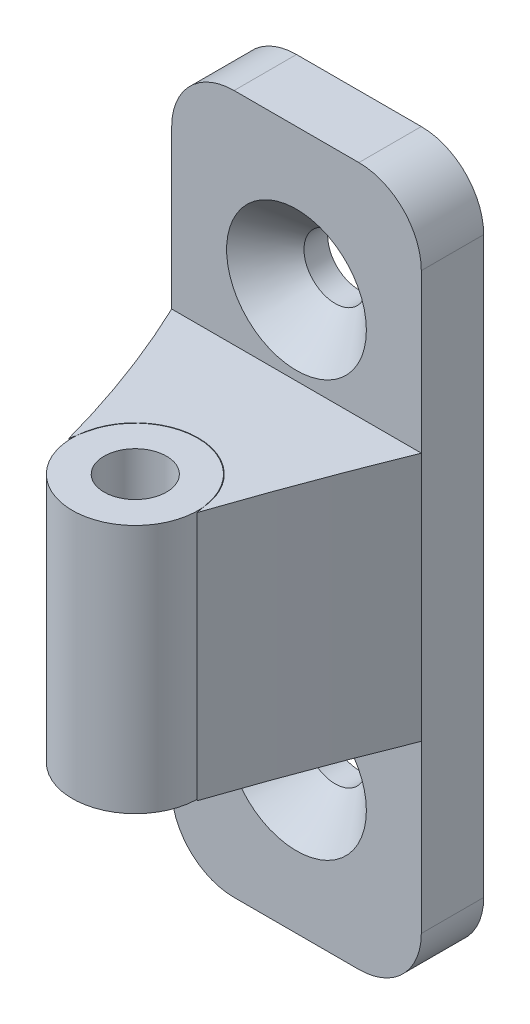
ISO-10303-21;
HEADER;
FILE_DESCRIPTION(('STEP AP214'),'2;1');
FILE_NAME('part.step','',(''),(''),'','','');
FILE_SCHEMA(('AUTOMOTIVE_DESIGN { 1 0 10303 214 1 1 1 1 }'));
ENDSEC;
DATA;
#1=APPLICATION_CONTEXT('core data for automotive mechanical design processes');
#2=APPLICATION_PROTOCOL_DEFINITION('international standard','automotive_design',2000,#1);
#3=PRODUCT_CONTEXT('',#1,'mechanical');
#4=PRODUCT('Part','Part','',(#3));
#5=PRODUCT_RELATED_PRODUCT_CATEGORY('part','',(#4));
#6=PRODUCT_DEFINITION_FORMATION('','',#4);
#7=PRODUCT_DEFINITION_CONTEXT('part definition',#1,'design');
#8=PRODUCT_DEFINITION('design','',#6,#7);
#9=PRODUCT_DEFINITION_SHAPE('','',#8);
#10=(LENGTH_UNIT() NAMED_UNIT(*) SI_UNIT(.MILLI.,.METRE.));
#11=(NAMED_UNIT(*) PLANE_ANGLE_UNIT() SI_UNIT($,.RADIAN.));
#12=(NAMED_UNIT(*) SI_UNIT($,.STERADIAN.) SOLID_ANGLE_UNIT());
#13=UNCERTAINTY_MEASURE_WITH_UNIT(LENGTH_MEASURE(1.E-05),#10,'distance_accuracy_value','');
#14=(GEOMETRIC_REPRESENTATION_CONTEXT(3) GLOBAL_UNCERTAINTY_ASSIGNED_CONTEXT((#13)) GLOBAL_UNIT_ASSIGNED_CONTEXT((#10,
#11,#12)) REPRESENTATION_CONTEXT('',''));
#15=CARTESIAN_POINT('',(0.,0.,0.));
#16=DIRECTION('',(0.,0.,1.));
#17=DIRECTION('',(1.,0.,0.));
#18=AXIS2_PLACEMENT_3D('',#15,#16,#17);
#19=CARTESIAN_POINT('',(45.4748031611298,-162.999999780208,24.4748018908058));
#20=DIRECTION('',(0.,-1.,0.));
#21=DIRECTION('',(0.,0.,-1.));
#22=AXIS2_PLACEMENT_3D('',#19,#20,#21);
#23=PLANE('',#22);
#24=DIRECTION('',(0.201858770187163,0.,0.979414639924545));
#25=VECTOR('',#24,1.);
#26=CARTESIAN_POINT('',(48.413047267168,-162.999999780208,23.1192250065496));
#27=LINE('',#26,#25);
#28=CARTESIAN_POINT('',(48.491701190835,-162.999999780208,23.5008522415495));
#29=VERTEX_POINT('',#28);
#30=CARTESIAN_POINT('',(48.5610012463893,-162.999999780208,23.8370946990582));
#31=VERTEX_POINT('',#30);
#32=EDGE_CURVE('P0_E11',#29,#31,#27,.T.);
#33=ORIENTED_EDGE('',*,*,#32,.T.);
#34=CARTESIAN_POINT('',(188.269411923261,-162.999999780208,71.1425910619827));
#35=DIRECTION('',(0.,1.,0.));
#36=DIRECTION('',(-0.947175665605907,0.,-0.320715229579149));
#37=AXIS2_PLACEMENT_3D('',#34,#35,#36);
#38=CIRCLE('',#37,147.5);
#39=CARTESIAN_POINT('',(51.4748032505368,-162.999999780208,15.9748012016271));
#40=VERTEX_POINT('',#39);
#41=EDGE_CURVE('P0_E212',#40,#31,#38,.T.);
#42=ORIENTED_EDGE('',*,*,#41,.F.);
#43=DIRECTION('',(1.,0.,0.));
#44=VECTOR('',#43,1.);
#45=CARTESIAN_POINT('',(47.9748031983828,-162.999999780208,15.9748012016271));
#46=LINE('',#45,#44);
#47=CARTESIAN_POINT('',(39.4748030717229,-162.999999780208,15.9748012016271));
#48=VERTEX_POINT('',#47);
#49=EDGE_CURVE('P0_E197',#48,#40,#46,.T.);
#50=ORIENTED_EDGE('',*,*,#49,.F.);
#51=CARTESIAN_POINT('',(-3.19879607523376,-162.999999780208,36.2609155620673));
#52=DIRECTION('',(0.,-1.,0.));
#53=DIRECTION('',(0.903144955491146,0.,-0.429335753660111));
#54=AXIS2_PLACEMENT_3D('',#51,#52,#53);
#55=CIRCLE('',#54,47.25);
#56=CARTESIAN_POINT('',(42.3886054303803,-162.999999780208,23.8370947340799));
#57=VERTEX_POINT('',#56);
#58=EDGE_CURVE('P0_E262',#48,#57,#55,.T.);
#59=ORIENTED_EDGE('',*,*,#58,.T.);
#60=DIRECTION('',(0.201858784323003,0.,-0.979414637011128));
#61=VECTOR('',#60,1.);
#62=CARTESIAN_POINT('',(40.505310523841,-162.999999780208,32.9748025799845));
#63=LINE('',#62,#61);
#64=CARTESIAN_POINT('',(42.4579055071859,-162.999999780208,23.5008521980068));
#65=VERTEX_POINT('',#64);
#66=EDGE_CURVE('P0_E336',#57,#65,#63,.T.);
#67=ORIENTED_EDGE('',*,*,#66,.T.);
#68=CARTESIAN_POINT('',(45.4748033473944,-162.999999780208,23.7248013171111));
#69=DIRECTION('',(0.,-1.,0.));
#70=DIRECTION('',(0.,0.,-1.));
#71=AXIS2_PLACEMENT_3D('',#68,#69,#70);
#72=CIRCLE('',#71,3.02519847054732);
#73=EDGE_CURVE('P0_E54',#65,#29,#72,.T.);
#74=ORIENTED_EDGE('',*,*,#73,.T.);
#75=EDGE_LOOP('',(#33,#42,#50,#59,#67,#74));
#76=FACE_BOUND('',#75,.T.);
#77=ADVANCED_FACE('P0_F51',(#76),#23,.F.);
#78=CARTESIAN_POINT('',(48.491701190835,-178.999999780208,23.5008522415495));
#79=DIRECTION('',(-0.979414639924545,0.,0.201858770187163));
#80=DIRECTION('',(0.,1.,0.));
#81=AXIS2_PLACEMENT_3D('',#78,#79,#80);
#82=PLANE('',#81);
#83=DIRECTION('',(0.201858770187163,0.,0.979414639924545));
#84=VECTOR('',#83,1.);
#85=CARTESIAN_POINT('',(48.5265130699368,-174.999999780208,23.6697587696331));
#86=LINE('',#85,#84);
#87=CARTESIAN_POINT('',(48.491701190835,-174.999999780208,23.5008522415495));
#88=VERTEX_POINT('',#87);
#89=CARTESIAN_POINT('',(48.5610012463893,-174.999999780208,23.8370946990582));
#90=VERTEX_POINT('',#89);
#91=EDGE_CURVE('P0_E289',#88,#90,#86,.T.);
#92=ORIENTED_EDGE('',*,*,#91,.T.);
#93=DIRECTION('',(0.,1.,0.));
#94=VECTOR('',#93,1.);
#95=CARTESIAN_POINT('',(48.5610012463893,-178.999999780208,23.8370946990582));
#96=LINE('',#95,#94);
#97=EDGE_CURVE('P0_E209',#90,#31,#96,.T.);
#98=ORIENTED_EDGE('',*,*,#97,.T.);
#99=ORIENTED_EDGE('',*,*,#32,.F.);
#100=DIRECTION('',(0.,1.,0.));
#101=VECTOR('',#100,1.);
#102=CARTESIAN_POINT('',(48.491701190835,-178.999999780208,23.5008522415495));
#103=LINE('',#102,#101);
#104=EDGE_CURVE('P0_E338',#88,#29,#103,.T.);
#105=ORIENTED_EDGE('',*,*,#104,.F.);
#106=EDGE_LOOP('',(#92,#98,#99,#105));
#107=FACE_BOUND('',#106,.T.);
#108=ADVANCED_FACE('P0_F395',(#107),#82,.T.);
#109=CARTESIAN_POINT('',(45.4748033473944,-178.999999780208,23.7248013171111));
#110=DIRECTION('',(0.,1.,0.));
#111=DIRECTION('',(0.,0.,-1.));
#112=AXIS2_PLACEMENT_3D('',#109,#110,#111);
#113=CYLINDRICAL_SURFACE('',#112,3.02519847054732);
#114=CARTESIAN_POINT('',(45.4748033473944,-174.999999780208,23.7248013171111));
#115=DIRECTION('',(0.,-1.,0.));
#116=DIRECTION('',(0.,0.,-1.));
#117=AXIS2_PLACEMENT_3D('',#114,#115,#116);
#118=CIRCLE('',#117,3.02519847054732);
#119=CARTESIAN_POINT('',(42.4579055071859,-174.999999780208,23.5008521980068));
#120=VERTEX_POINT('',#119);
#121=EDGE_CURVE('P0_E292',#120,#88,#118,.T.);
#122=ORIENTED_EDGE('',*,*,#121,.T.);
#123=ORIENTED_EDGE('',*,*,#104,.T.);
#124=ORIENTED_EDGE('',*,*,#73,.F.);
#125=DIRECTION('',(0.,1.,0.));
#126=VECTOR('',#125,1.);
#127=CARTESIAN_POINT('',(42.4579055071859,-178.999999780208,23.5008521980068));
#128=LINE('',#127,#126);
#129=EDGE_CURVE('P0_E335',#120,#65,#128,.T.);
#130=ORIENTED_EDGE('',*,*,#129,.F.);
#131=EDGE_LOOP('',(#122,#123,#124,#130));
#132=FACE_BOUND('',#131,.T.);
#133=ADVANCED_FACE('P0_F400',(#132),#113,.F.);
#134=CARTESIAN_POINT('',(42.3886054303803,-178.999999780208,23.8370947340799));
#135=DIRECTION('',(0.979414637011128,0.,0.201858784323003));
#136=DIRECTION('',(0.,-1.,0.));
#137=AXIS2_PLACEMENT_3D('',#134,#135,#136);
#138=PLANE('',#137);
#139=DIRECTION('',(0.201858784323003,0.,-0.979414637011128));
#140=VECTOR('',#139,1.);
#141=CARTESIAN_POINT('',(42.3884435798744,-174.999999780208,23.8378800293796));
#142=LINE('',#141,#140);
#143=CARTESIAN_POINT('',(42.3886054303803,-174.999999780208,23.8370947340799));
#144=VERTEX_POINT('',#143);
#145=EDGE_CURVE('P0_E331',#144,#120,#142,.T.);
#146=ORIENTED_EDGE('',*,*,#145,.T.);
#147=ORIENTED_EDGE('',*,*,#129,.T.);
#148=ORIENTED_EDGE('',*,*,#66,.F.);
#149=DIRECTION('',(0.,1.,0.));
#150=VECTOR('',#149,1.);
#151=CARTESIAN_POINT('',(42.3886054303803,-178.999999780208,23.8370947340799));
#152=LINE('',#151,#150);
#153=EDGE_CURVE('P0_E258',#144,#57,#152,.T.);
#154=ORIENTED_EDGE('',*,*,#153,.F.);
#155=EDGE_LOOP('',(#146,#147,#148,#154));
#156=FACE_BOUND('',#155,.T.);
#157=ADVANCED_FACE('P0_F348',(#156),#138,.T.);
#158=CARTESIAN_POINT('',(45.4748031611298,-174.999999780208,24.4748018908058));
#159=DIRECTION('',(0.,-1.,0.));
#160=DIRECTION('',(0.,0.,-1.));
#161=AXIS2_PLACEMENT_3D('',#158,#159,#160);
#162=PLANE('',#161);
#163=ORIENTED_EDGE('',*,*,#91,.F.);
#164=ORIENTED_EDGE('',*,*,#121,.F.);
#165=ORIENTED_EDGE('',*,*,#145,.F.);
#166=CARTESIAN_POINT('',(-3.19879607523376,-174.999999780208,36.2609155620673));
#167=DIRECTION('',(0.,-1.,0.));
#168=DIRECTION('',(0.903144955491146,0.,-0.429335753660111));
#169=AXIS2_PLACEMENT_3D('',#166,#167,#168);
#170=CIRCLE('',#169,47.25);
#171=CARTESIAN_POINT('',(39.4748030717229,-174.999999780208,15.9748012016271));
#172=VERTEX_POINT('',#171);
#173=EDGE_CURVE('P0_E254',#172,#144,#170,.T.);
#174=ORIENTED_EDGE('',*,*,#173,.F.);
#175=DIRECTION('',(-1.,0.,0.));
#176=VECTOR('',#175,1.);
#177=CARTESIAN_POINT('',(47.9748031983828,-174.999999780208,15.9748012016271));
#178=LINE('',#177,#176);
#179=CARTESIAN_POINT('',(51.4748032505368,-174.999999780208,15.9748012016271));
#180=VERTEX_POINT('',#179);
#181=EDGE_CURVE('P0_E265',#180,#172,#178,.T.);
#182=ORIENTED_EDGE('',*,*,#181,.F.);
#183=CARTESIAN_POINT('',(188.269411923261,-174.999999780208,71.1425910619827));
#184=DIRECTION('',(0.,1.,0.));
#185=DIRECTION('',(-0.947175665605907,0.,-0.320715229579149));
#186=AXIS2_PLACEMENT_3D('',#183,#184,#185);
#187=CIRCLE('',#186,147.5);
#188=EDGE_CURVE('P0_E219',#180,#90,#187,.T.);
#189=ORIENTED_EDGE('',*,*,#188,.T.);
#190=EDGE_LOOP('',(#163,#164,#165,#174,#182,#189));
#191=FACE_BOUND('',#190,.T.);
#192=ADVANCED_FACE('P0_F408',(#191),#162,.T.);
#193=CARTESIAN_POINT('',(45.4748031611298,-169.201648260332,12.9748012016271));
#194=DIRECTION('',(0.,0.,-1.));
#195=DIRECTION('',(-1.,0.,0.));
#196=AXIS2_PLACEMENT_3D('',#193,#194,#195);
#197=PLANE('',#196);
#198=CARTESIAN_POINT('',(45.4748031611298,-179.201648260332,12.9748012016271));
#199=DIRECTION('',(0.,0.,1.));
#200=DIRECTION('',(0.,1.,0.));
#201=AXIS2_PLACEMENT_3D('',#198,#199,#200);
#202=CIRCLE('',#201,1.5);
#203=CARTESIAN_POINT('',(45.4748031611298,-177.701648260332,12.9748012016271));
#204=VERTEX_POINT('',#203);
#205=EDGE_CURVE('P0_E225',#204,#204,#202,.T.);
#206=ORIENTED_EDGE('',*,*,#205,.T.);
#207=EDGE_LOOP('',(#206));
#208=FACE_BOUND('',#207,.T.);
#209=CARTESIAN_POINT('',(45.4748031611298,-159.201648260332,12.9748012016271));
#210=DIRECTION('',(0.,0.,1.));
#211=DIRECTION('',(0.,1.,0.));
#212=AXIS2_PLACEMENT_3D('',#209,#210,#211);
#213=CIRCLE('',#212,1.5);
#214=CARTESIAN_POINT('',(45.4748031611298,-157.701648260332,12.9748012016271));
#215=VERTEX_POINT('',#214);
#216=EDGE_CURVE('P0_E358',#215,#215,#213,.T.);
#217=ORIENTED_EDGE('',*,*,#216,.T.);
#218=EDGE_LOOP('',(#217));
#219=FACE_BOUND('',#218,.T.);
#220=DIRECTION('',(0.,-1.,0.));
#221=VECTOR('',#220,1.);
#222=CARTESIAN_POINT('',(51.4748032505368,-161.999999765307,12.9748012016271));
#223=LINE('',#222,#221);
#224=CARTESIAN_POINT('',(51.4748032505368,-155.403295239165,12.9748012016271));
#225=VERTEX_POINT('',#224);
#226=CARTESIAN_POINT('',(51.4748032505368,-183.0000012815,12.9748012016271));
#227=VERTEX_POINT('',#226);
#228=EDGE_CURVE('P0_E293',#225,#227,#223,.T.);
#229=ORIENTED_EDGE('',*,*,#228,.T.);
#230=CARTESIAN_POINT('',(48.4748032505368,-183.0000012815,12.9748012016271));
#231=DIRECTION('',(0.,0.,-1.));
#232=DIRECTION('',(1.,0.,0.));
#233=AXIS2_PLACEMENT_3D('',#230,#231,#232);
#234=CIRCLE('',#233,3.);
#235=CARTESIAN_POINT('',(48.4748032505368,-186.0000012815,12.9748012016271));
#236=VERTEX_POINT('',#235);
#237=EDGE_CURVE('P0_E252',#227,#236,#234,.T.);
#238=ORIENTED_EDGE('',*,*,#237,.T.);
#239=DIRECTION('',(-1.,0.,0.));
#240=VECTOR('',#239,1.);
#241=CARTESIAN_POINT('',(48.4748032505368,-186.0000012815,12.9748012016271));
#242=LINE('',#241,#240);
#243=CARTESIAN_POINT('',(42.4748030717229,-186.0000012815,12.9748012016271));
#244=VERTEX_POINT('',#243);
#245=EDGE_CURVE('P0_E253',#236,#244,#242,.T.);
#246=ORIENTED_EDGE('',*,*,#245,.T.);
#247=CARTESIAN_POINT('',(42.4748030717229,-183.0000012815,12.9748012016271));
#248=DIRECTION('',(0.,0.,-1.));
#249=DIRECTION('',(0.,-1.,0.));
#250=AXIS2_PLACEMENT_3D('',#247,#248,#249);
#251=CIRCLE('',#250,3.);
#252=CARTESIAN_POINT('',(39.4748030717229,-183.0000012815,12.9748012016271));
#253=VERTEX_POINT('',#252);
#254=EDGE_CURVE('P0_E239',#244,#253,#251,.T.);
#255=ORIENTED_EDGE('',*,*,#254,.T.);
#256=DIRECTION('',(0.,1.,0.));
#257=VECTOR('',#256,1.);
#258=CARTESIAN_POINT('',(39.4748030717229,-183.0000012815,12.9748012016271));
#259=LINE('',#258,#257);
#260=CARTESIAN_POINT('',(39.4748030717229,-155.403295239165,12.9748012016271));
#261=VERTEX_POINT('',#260);
#262=EDGE_CURVE('P0_E228',#253,#261,#259,.T.);
#263=ORIENTED_EDGE('',*,*,#262,.T.);
#264=CARTESIAN_POINT('',(42.4748030717229,-155.403295239165,12.9748012016271));
#265=DIRECTION('',(0.,0.,-1.));
#266=DIRECTION('',(-1.,0.,0.));
#267=AXIS2_PLACEMENT_3D('',#264,#265,#266);
#268=CIRCLE('',#267,3.);
#269=CARTESIAN_POINT('',(42.4748030717229,-152.403295239165,12.9748012016271));
#270=VERTEX_POINT('',#269);
#271=EDGE_CURVE('P0_E315',#261,#270,#268,.T.);
#272=ORIENTED_EDGE('',*,*,#271,.T.);
#273=DIRECTION('',(1.,0.,0.));
#274=VECTOR('',#273,1.);
#275=CARTESIAN_POINT('',(48.4748032505368,-152.403295239165,12.9748012016271));
#276=LINE('',#275,#274);
#277=CARTESIAN_POINT('',(48.4748032505368,-152.403295239165,12.9748012016271));
#278=VERTEX_POINT('',#277);
#279=EDGE_CURVE('P0_E306',#270,#278,#276,.T.);
#280=ORIENTED_EDGE('',*,*,#279,.T.);
#281=CARTESIAN_POINT('',(48.4748032505368,-155.403295239165,12.9748012016271));
#282=DIRECTION('',(0.,0.,-1.));
#283=DIRECTION('',(0.,1.,0.));
#284=AXIS2_PLACEMENT_3D('',#281,#282,#283);
#285=CIRCLE('',#284,3.);
#286=EDGE_CURVE('P0_E301',#278,#225,#285,.T.);
#287=ORIENTED_EDGE('',*,*,#286,.T.);
#288=EDGE_LOOP('',(#229,#238,#246,#255,#263,#272,#280,#287));
#289=FACE_BOUND('',#288,.T.);
#290=ADVANCED_FACE('P0_F374',(#208,#219,#289),#197,.T.);
#291=CARTESIAN_POINT('',(51.4748032505368,-155.403295239165,15.9748012016271));
#292=DIRECTION('',(1.,0.,0.));
#293=DIRECTION('',(0.,0.,-1.));
#294=AXIS2_PLACEMENT_3D('',#291,#292,#293);
#295=PLANE('',#294);
#296=DIRECTION('',(0.,-1.,0.));
#297=VECTOR('',#296,1.);
#298=CARTESIAN_POINT('',(51.4748032505368,-161.999999765307,15.9748012016271));
#299=LINE('',#298,#297);
#300=CARTESIAN_POINT('',(51.4748032505368,-155.403295239165,15.9748012016271));
#301=VERTEX_POINT('',#300);
#302=EDGE_CURVE('P0_E183',#301,#40,#299,.T.);
#303=ORIENTED_EDGE('',*,*,#302,.T.);
#304=DIRECTION('',(0.,-1.,0.));
#305=VECTOR('',#304,1.);
#306=CARTESIAN_POINT('',(51.4748032505368,-161.999999765307,15.9748012016271));
#307=LINE('',#306,#305);
#308=EDGE_CURVE('P0_E188',#40,#180,#307,.T.);
#309=ORIENTED_EDGE('',*,*,#308,.T.);
#310=DIRECTION('',(0.,-1.,0.));
#311=VECTOR('',#310,1.);
#312=CARTESIAN_POINT('',(51.4748032505368,-161.999999765307,15.9748012016271));
#313=LINE('',#312,#311);
#314=CARTESIAN_POINT('',(51.4748032505368,-183.0000012815,15.9748012016271));
#315=VERTEX_POINT('',#314);
#316=EDGE_CURVE('P0_E288',#180,#315,#313,.T.);
#317=ORIENTED_EDGE('',*,*,#316,.T.);
#318=DIRECTION('',(0.,0.,-1.));
#319=VECTOR('',#318,1.);
#320=CARTESIAN_POINT('',(51.4748032505368,-183.0000012815,15.9748012016271));
#321=LINE('',#320,#319);
#322=EDGE_CURVE('P0_E298',#315,#227,#321,.T.);
#323=ORIENTED_EDGE('',*,*,#322,.T.);
#324=ORIENTED_EDGE('',*,*,#228,.F.);
#325=DIRECTION('',(0.,0.,-1.));
#326=VECTOR('',#325,1.);
#327=CARTESIAN_POINT('',(51.4748032505368,-155.403295239165,15.9748012016271));
#328=LINE('',#327,#326);
#329=EDGE_CURVE('P0_E191',#301,#225,#328,.T.);
#330=ORIENTED_EDGE('',*,*,#329,.F.);
#331=EDGE_LOOP('',(#303,#309,#317,#323,#324,#330));
#332=FACE_BOUND('',#331,.T.);
#333=ADVANCED_FACE('P0_F185',(#332),#295,.T.);
#334=CARTESIAN_POINT('',(48.4748032505368,-183.0000012815,15.9748012016271));
#335=DIRECTION('',(0.,0.,-1.));
#336=DIRECTION('',(1.,0.,0.));
#337=AXIS2_PLACEMENT_3D('',#334,#335,#336);
#338=CYLINDRICAL_SURFACE('',#337,3.);
#339=CARTESIAN_POINT('',(48.4748032505368,-183.0000012815,15.9748012016271));
#340=DIRECTION('',(0.,0.,-1.));
#341=DIRECTION('',(1.,0.,0.));
#342=AXIS2_PLACEMENT_3D('',#339,#340,#341);
#343=CIRCLE('',#342,3.);
#344=CARTESIAN_POINT('',(48.4748032505368,-186.0000012815,15.9748012016271));
#345=VERTEX_POINT('',#344);
#346=EDGE_CURVE('P0_E284',#315,#345,#343,.T.);
#347=ORIENTED_EDGE('',*,*,#346,.T.);
#348=DIRECTION('',(0.,0.,-1.));
#349=VECTOR('',#348,1.);
#350=CARTESIAN_POINT('',(48.4748032505368,-186.0000012815,15.9748012016271));
#351=LINE('',#350,#349);
#352=EDGE_CURVE('P0_E248',#345,#236,#351,.T.);
#353=ORIENTED_EDGE('',*,*,#352,.T.);
#354=ORIENTED_EDGE('',*,*,#237,.F.);
#355=ORIENTED_EDGE('',*,*,#322,.F.);
#356=EDGE_LOOP('',(#347,#353,#354,#355));
#357=FACE_BOUND('',#356,.T.);
#358=ADVANCED_FACE('P0_F416',(#357),#338,.T.);
#359=CARTESIAN_POINT('',(48.4748032505368,-186.0000012815,15.9748012016271));
#360=DIRECTION('',(0.,-1.,0.));
#361=DIRECTION('',(0.,0.,-1.));
#362=AXIS2_PLACEMENT_3D('',#359,#360,#361);
#363=PLANE('',#362);
#364=DIRECTION('',(-1.,0.,0.));
#365=VECTOR('',#364,1.);
#366=CARTESIAN_POINT('',(48.4748032505368,-186.0000012815,15.9748012016271));
#367=LINE('',#366,#365);
#368=CARTESIAN_POINT('',(42.4748030717229,-186.0000012815,15.9748012016271));
#369=VERTEX_POINT('',#368);
#370=EDGE_CURVE('P0_E277',#345,#369,#367,.T.);
#371=ORIENTED_EDGE('',*,*,#370,.T.);
#372=DIRECTION('',(0.,0.,-1.));
#373=VECTOR('',#372,1.);
#374=CARTESIAN_POINT('',(42.4748030717229,-186.0000012815,15.9748012016271));
#375=LINE('',#374,#373);
#376=EDGE_CURVE('P0_E280',#369,#244,#375,.T.);
#377=ORIENTED_EDGE('',*,*,#376,.T.);
#378=ORIENTED_EDGE('',*,*,#245,.F.);
#379=ORIENTED_EDGE('',*,*,#352,.F.);
#380=EDGE_LOOP('',(#371,#377,#378,#379));
#381=FACE_BOUND('',#380,.T.);
#382=ADVANCED_FACE('P0_F419',(#381),#363,.T.);
#383=CARTESIAN_POINT('',(42.4748030717229,-183.0000012815,15.9748012016271));
#384=DIRECTION('',(0.,0.,-1.));
#385=DIRECTION('',(0.,-1.,0.));
#386=AXIS2_PLACEMENT_3D('',#383,#384,#385);
#387=CYLINDRICAL_SURFACE('',#386,3.);
#388=CARTESIAN_POINT('',(42.4748030717229,-183.0000012815,15.9748012016271));
#389=DIRECTION('',(0.,0.,-1.));
#390=DIRECTION('',(0.,-1.,0.));
#391=AXIS2_PLACEMENT_3D('',#388,#389,#390);
#392=CIRCLE('',#391,3.);
#393=CARTESIAN_POINT('',(39.4748030717229,-183.0000012815,15.9748012016271));
#394=VERTEX_POINT('',#393);
#395=EDGE_CURVE('P0_E273',#369,#394,#392,.T.);
#396=ORIENTED_EDGE('',*,*,#395,.T.);
#397=DIRECTION('',(0.,0.,-1.));
#398=VECTOR('',#397,1.);
#399=CARTESIAN_POINT('',(39.4748030717229,-183.0000012815,15.9748012016271));
#400=LINE('',#399,#398);
#401=EDGE_CURVE('P0_E236',#394,#253,#400,.T.);
#402=ORIENTED_EDGE('',*,*,#401,.T.);
#403=ORIENTED_EDGE('',*,*,#254,.F.);
#404=ORIENTED_EDGE('',*,*,#376,.F.);
#405=EDGE_LOOP('',(#396,#402,#403,#404));
#406=FACE_BOUND('',#405,.T.);
#407=ADVANCED_FACE('P0_F425',(#406),#387,.T.);
#408=CARTESIAN_POINT('',(39.4748030717229,-183.0000012815,15.9748012016271));
#409=DIRECTION('',(-1.,0.,0.));
#410=DIRECTION('',(0.,0.,1.));
#411=AXIS2_PLACEMENT_3D('',#408,#409,#410);
#412=PLANE('',#411);
#413=DIRECTION('',(0.,1.,0.));
#414=VECTOR('',#413,1.);
#415=CARTESIAN_POINT('',(39.4748030717229,-183.0000012815,15.9748012016271));
#416=LINE('',#415,#414);
#417=EDGE_CURVE('P0_E270',#394,#172,#416,.T.);
#418=ORIENTED_EDGE('',*,*,#417,.T.);
#419=DIRECTION('',(0.,1.,0.));
#420=VECTOR('',#419,1.);
#421=CARTESIAN_POINT('',(39.4748030717229,-183.0000012815,15.9748012016271));
#422=LINE('',#421,#420);
#423=EDGE_CURVE('P0_E263',#172,#48,#422,.T.);
#424=ORIENTED_EDGE('',*,*,#423,.T.);
#425=DIRECTION('',(0.,1.,0.));
#426=VECTOR('',#425,1.);
#427=CARTESIAN_POINT('',(39.4748030717229,-183.0000012815,15.9748012016271));
#428=LINE('',#427,#426);
#429=CARTESIAN_POINT('',(39.4748030717229,-155.403295239165,15.9748012016271));
#430=VERTEX_POINT('',#429);
#431=EDGE_CURVE('P0_E205',#48,#430,#428,.T.);
#432=ORIENTED_EDGE('',*,*,#431,.T.);
#433=DIRECTION('',(0.,0.,-1.));
#434=VECTOR('',#433,1.);
#435=CARTESIAN_POINT('',(39.4748030717229,-155.403295239165,15.9748012016271));
#436=LINE('',#435,#434);
#437=EDGE_CURVE('P0_E316',#430,#261,#436,.T.);
#438=ORIENTED_EDGE('',*,*,#437,.T.);
#439=ORIENTED_EDGE('',*,*,#262,.F.);
#440=ORIENTED_EDGE('',*,*,#401,.F.);
#441=EDGE_LOOP('',(#418,#424,#432,#438,#439,#440));
#442=FACE_BOUND('',#441,.T.);
#443=ADVANCED_FACE('P0_F421',(#442),#412,.T.);
#444=CARTESIAN_POINT('',(42.4748030717229,-155.403295239165,15.9748012016271));
#445=DIRECTION('',(0.,0.,-1.));
#446=DIRECTION('',(-1.,0.,0.));
#447=AXIS2_PLACEMENT_3D('',#444,#445,#446);
#448=CYLINDRICAL_SURFACE('',#447,3.);
#449=CARTESIAN_POINT('',(42.4748030717229,-155.403295239165,15.9748012016271));
#450=DIRECTION('',(0.,0.,-1.));
#451=DIRECTION('',(-1.,0.,0.));
#452=AXIS2_PLACEMENT_3D('',#449,#450,#451);
#453=CIRCLE('',#452,3.);
#454=CARTESIAN_POINT('',(42.4748030717229,-152.403295239165,15.9748012016271));
#455=VERTEX_POINT('',#454);
#456=EDGE_CURVE('P0_E234',#430,#455,#453,.T.);
#457=ORIENTED_EDGE('',*,*,#456,.T.);
#458=DIRECTION('',(0.,0.,-1.));
#459=VECTOR('',#458,1.);
#460=CARTESIAN_POINT('',(42.4748030717229,-152.403295239165,15.9748012016271));
#461=LINE('',#460,#459);
#462=EDGE_CURVE('P0_E311',#455,#270,#461,.T.);
#463=ORIENTED_EDGE('',*,*,#462,.T.);
#464=ORIENTED_EDGE('',*,*,#271,.F.);
#465=ORIENTED_EDGE('',*,*,#437,.F.);
#466=EDGE_LOOP('',(#457,#463,#464,#465));
#467=FACE_BOUND('',#466,.T.);
#468=ADVANCED_FACE('P0_F424',(#467),#448,.T.);
#469=CARTESIAN_POINT('',(42.4748030717229,-152.403295239165,15.9748012016271));
#470=DIRECTION('',(0.,1.,0.));
#471=DIRECTION('',(1.,0.,0.));
#472=AXIS2_PLACEMENT_3D('',#469,#470,#471);
#473=PLANE('',#472);
#474=DIRECTION('',(-1.,0.,0.));
#475=VECTOR('',#474,1.);
#476=CARTESIAN_POINT('',(48.4748032505368,-152.403295239165,15.9748012016271));
#477=LINE('',#476,#475);
#478=CARTESIAN_POINT('',(48.4748032505368,-152.403295239165,15.9748012016271));
#479=VERTEX_POINT('',#478);
#480=EDGE_CURVE('P0_E231',#479,#455,#477,.T.);
#481=ORIENTED_EDGE('',*,*,#480,.F.);
#482=DIRECTION('',(0.,0.,-1.));
#483=VECTOR('',#482,1.);
#484=CARTESIAN_POINT('',(48.4748032505368,-152.403295239165,15.9748012016271));
#485=LINE('',#484,#483);
#486=EDGE_CURVE('P0_E302',#479,#278,#485,.T.);
#487=ORIENTED_EDGE('',*,*,#486,.T.);
#488=ORIENTED_EDGE('',*,*,#279,.F.);
#489=ORIENTED_EDGE('',*,*,#462,.F.);
#490=EDGE_LOOP('',(#481,#487,#488,#489));
#491=FACE_BOUND('',#490,.T.);
#492=ADVANCED_FACE('P0_F430',(#491),#473,.T.);
#493=CARTESIAN_POINT('',(48.4748032505368,-155.403295239165,15.9748012016271));
#494=DIRECTION('',(0.,0.,-1.));
#495=DIRECTION('',(0.,1.,0.));
#496=AXIS2_PLACEMENT_3D('',#493,#494,#495);
#497=CYLINDRICAL_SURFACE('',#496,3.);
#498=CARTESIAN_POINT('',(48.4748032505368,-155.403295239165,15.9748012016271));
#499=DIRECTION('',(0.,0.,-1.));
#500=DIRECTION('',(0.,1.,0.));
#501=AXIS2_PLACEMENT_3D('',#498,#499,#500);
#502=CIRCLE('',#501,3.);
#503=EDGE_CURVE('P0_E196',#479,#301,#502,.T.);
#504=ORIENTED_EDGE('',*,*,#503,.T.);
#505=ORIENTED_EDGE('',*,*,#329,.T.);
#506=ORIENTED_EDGE('',*,*,#286,.F.);
#507=ORIENTED_EDGE('',*,*,#486,.F.);
#508=EDGE_LOOP('',(#504,#505,#506,#507));
#509=FACE_BOUND('',#508,.T.);
#510=ADVANCED_FACE('P0_F432',(#509),#497,.T.);
#511=CARTESIAN_POINT('',(50.4748032356357,-178.999999780208,15.9748012016271));
#512=DIRECTION('',(0.,0.,-1.));
#513=DIRECTION('',(-1.,0.,0.));
#514=AXIS2_PLACEMENT_3D('',#511,#512,#513);
#515=PLANE('',#514);
#516=CARTESIAN_POINT('',(45.4748031611298,-179.201648260332,15.9748012016271));
#517=DIRECTION('',(0.,0.,1.));
#518=DIRECTION('',(1.,0.,0.));
#519=AXIS2_PLACEMENT_3D('',#516,#517,#518);
#520=CIRCLE('',#519,3.36);
#521=CARTESIAN_POINT('',(48.8348031611298,-179.201648260332,15.9748012016271));
#522=VERTEX_POINT('',#521);
#523=EDGE_CURVE('P0_E607',#522,#522,#520,.T.);
#524=ORIENTED_EDGE('',*,*,#523,.F.);
#525=EDGE_LOOP('',(#524));
#526=FACE_BOUND('',#525,.T.);
#527=ORIENTED_EDGE('',*,*,#181,.T.);
#528=ORIENTED_EDGE('',*,*,#417,.F.);
#529=ORIENTED_EDGE('',*,*,#395,.F.);
#530=ORIENTED_EDGE('',*,*,#370,.F.);
#531=ORIENTED_EDGE('',*,*,#346,.F.);
#532=ORIENTED_EDGE('',*,*,#316,.F.);
#533=EDGE_LOOP('',(#527,#528,#529,#530,#531,#532));
#534=FACE_BOUND('',#533,.T.);
#535=ADVANCED_FACE('P0_F436',(#526,#534),#515,.F.);
#536=CARTESIAN_POINT('',(-3.19879607523376,-183.0000012815,36.2609155620673));
#537=DIRECTION('',(0.,-1.,0.));
#538=DIRECTION('',(0.903144955491146,0.,-0.429335753660111));
#539=AXIS2_PLACEMENT_3D('',#536,#537,#538);
#540=CYLINDRICAL_SURFACE('',#539,47.25);
#541=ORIENTED_EDGE('',*,*,#173,.T.);
#542=ORIENTED_EDGE('',*,*,#153,.T.);
#543=ORIENTED_EDGE('',*,*,#58,.F.);
#544=ORIENTED_EDGE('',*,*,#423,.F.);
#545=EDGE_LOOP('',(#541,#542,#543,#544));
#546=FACE_BOUND('',#545,.T.);
#547=ADVANCED_FACE('P0_F440',(#546),#540,.F.);
#548=CARTESIAN_POINT('',(50.4748032356357,-178.999999780208,15.9748012016271));
#549=DIRECTION('',(0.,0.,-1.));
#550=DIRECTION('',(-1.,0.,0.));
#551=AXIS2_PLACEMENT_3D('',#548,#549,#550);
#552=PLANE('',#551);
#553=CARTESIAN_POINT('',(45.4748031611298,-159.201648260332,15.9748012016271));
#554=DIRECTION('',(0.,0.,1.));
#555=DIRECTION('',(1.,0.,0.));
#556=AXIS2_PLACEMENT_3D('',#553,#554,#555);
#557=CIRCLE('',#556,3.36);
#558=CARTESIAN_POINT('',(48.8348031611298,-159.201648260332,15.9748012016271));
#559=VERTEX_POINT('',#558);
#560=EDGE_CURVE('P0_E605',#559,#559,#557,.T.);
#561=ORIENTED_EDGE('',*,*,#560,.F.);
#562=EDGE_LOOP('',(#561));
#563=FACE_BOUND('',#562,.T.);
#564=ORIENTED_EDGE('',*,*,#49,.T.);
#565=ORIENTED_EDGE('',*,*,#302,.F.);
#566=ORIENTED_EDGE('',*,*,#503,.F.);
#567=ORIENTED_EDGE('',*,*,#480,.T.);
#568=ORIENTED_EDGE('',*,*,#456,.F.);
#569=ORIENTED_EDGE('',*,*,#431,.F.);
#570=EDGE_LOOP('',(#564,#565,#566,#567,#568,#569));
#571=FACE_BOUND('',#570,.T.);
#572=ADVANCED_FACE('P0_F202',(#563,#571),#552,.F.);
#573=CARTESIAN_POINT('',(188.269411923261,-178.999999780208,71.1425910619827));
#574=DIRECTION('',(0.,-1.,0.));
#575=DIRECTION('',(-0.947175665605907,0.,-0.320715229579149));
#576=AXIS2_PLACEMENT_3D('',#573,#574,#575);
#577=CYLINDRICAL_SURFACE('',#576,147.5);
#578=ORIENTED_EDGE('',*,*,#188,.F.);
#579=ORIENTED_EDGE('',*,*,#308,.F.);
#580=ORIENTED_EDGE('',*,*,#41,.T.);
#581=ORIENTED_EDGE('',*,*,#97,.F.);
#582=EDGE_LOOP('',(#578,#579,#580,#581));
#583=FACE_BOUND('',#582,.T.);
#584=ADVANCED_FACE('P0_F217',(#583),#577,.F.);
#585=CARTESIAN_POINT('',(45.4748031611298,-179.201648260332,12.9748012016271));
#586=DIRECTION('',(0.,0.,1.));
#587=DIRECTION('',(0.,1.,0.));
#588=AXIS2_PLACEMENT_3D('',#585,#586,#587);
#589=CYLINDRICAL_SURFACE('',#588,1.5);
#590=CARTESIAN_POINT('',(45.4748031611298,-179.201648260332,14.1148012016271));
#591=DIRECTION('',(0.,0.,1.));
#592=DIRECTION('',(1.,0.,0.));
#593=AXIS2_PLACEMENT_3D('',#590,#591,#592);
#594=CIRCLE('',#593,1.49999999999999);
#595=CARTESIAN_POINT('',(46.9748031611298,-179.201648260332,14.1148012016271));
#596=VERTEX_POINT('',#595);
#597=EDGE_CURVE('P0_E356',#596,#596,#594,.T.);
#598=ORIENTED_EDGE('',*,*,#597,.T.);
#599=EDGE_LOOP('',(#598));
#600=FACE_BOUND('',#599,.T.);
#601=ORIENTED_EDGE('',*,*,#205,.F.);
#602=EDGE_LOOP('',(#601));
#603=FACE_BOUND('',#602,.T.);
#604=ADVANCED_FACE('P0_F377',(#600,#603),#589,.F.);
#605=CARTESIAN_POINT('',(45.4748031611298,-159.201648260332,12.9748012016271));
#606=DIRECTION('',(0.,0.,1.));
#607=DIRECTION('',(0.,1.,0.));
#608=AXIS2_PLACEMENT_3D('',#605,#606,#607);
#609=CYLINDRICAL_SURFACE('',#608,1.5);
#610=CARTESIAN_POINT('',(45.4748031611298,-159.201648260332,14.1148012016271));
#611=DIRECTION('',(0.,0.,1.));
#612=DIRECTION('',(1.,0.,0.));
#613=AXIS2_PLACEMENT_3D('',#610,#611,#612);
#614=CIRCLE('',#613,1.49999999999999);
#615=CARTESIAN_POINT('',(46.9748031611298,-159.201648260332,14.1148012016271));
#616=VERTEX_POINT('',#615);
#617=EDGE_CURVE('P0_E602',#616,#616,#614,.T.);
#618=ORIENTED_EDGE('',*,*,#617,.T.);
#619=EDGE_LOOP('',(#618));
#620=FACE_BOUND('',#619,.T.);
#621=ORIENTED_EDGE('',*,*,#216,.F.);
#622=EDGE_LOOP('',(#621));
#623=FACE_BOUND('',#622,.T.);
#624=ADVANCED_FACE('P0_F379',(#620,#623),#609,.F.);
#625=CARTESIAN_POINT('',(45.4748031611298,-179.201648260332,15.9748012016271));
#626=DIRECTION('',(0.,0.,1.));
#627=DIRECTION('',(1.,0.,0.));
#628=AXIS2_PLACEMENT_3D('',#625,#626,#627);
#629=CONICAL_SURFACE('',#628,3.36,0.785398163397448);
#630=ORIENTED_EDGE('',*,*,#597,.F.);
#631=EDGE_LOOP('',(#630));
#632=FACE_BOUND('',#631,.T.);
#633=ORIENTED_EDGE('',*,*,#523,.T.);
#634=EDGE_LOOP('',(#633));
#635=FACE_BOUND('',#634,.T.);
#636=ADVANCED_FACE('P0_F386',(#632,#635),#629,.F.);
#637=CARTESIAN_POINT('',(45.4748031611298,-159.201648260332,15.9748012016271));
#638=DIRECTION('',(0.,0.,1.));
#639=DIRECTION('',(1.,0.,0.));
#640=AXIS2_PLACEMENT_3D('',#637,#638,#639);
#641=CONICAL_SURFACE('',#640,3.36,0.785398163397448);
#642=ORIENTED_EDGE('',*,*,#617,.F.);
#643=EDGE_LOOP('',(#642));
#644=FACE_BOUND('',#643,.T.);
#645=ORIENTED_EDGE('',*,*,#560,.T.);
#646=EDGE_LOOP('',(#645));
#647=FACE_BOUND('',#646,.T.);
#648=ADVANCED_FACE('P0_F587',(#644,#647),#641,.F.);
#649=CLOSED_SHELL('',(#77,#108,#133,#157,#192,#290,#333,#358,#382,#407,#443,#468,#492,#510,#535,
#547,#572,#584,#604,#624,#636,#648));
#650=MANIFOLD_SOLID_BREP('P0_B2',#649);
#651=CARTESIAN_POINT('',(45.4748031611298,-174.999999780208,24.4748018908058));
#652=DIRECTION('',(0.,-1.,0.));
#653=DIRECTION('',(0.,0.,-1.));
#654=AXIS2_PLACEMENT_3D('',#651,#652,#653);
#655=PLANE('',#654);
#656=CARTESIAN_POINT('',(45.4748033473944,-174.999999780208,23.7248013171111));
#657=DIRECTION('',(0.,-1.,0.));
#658=DIRECTION('',(0.,0.,-1.));
#659=AXIS2_PLACEMENT_3D('',#656,#657,#658);
#660=CIRCLE('',#659,1.5);
#661=CARTESIAN_POINT('',(45.4748033473944,-174.999999780208,25.2248013171111));
#662=VERTEX_POINT('',#661);
#663=EDGE_CURVE('P1_E128',#662,#662,#660,.T.);
#664=ORIENTED_EDGE('',*,*,#663,.F.);
#665=EDGE_LOOP('',(#664));
#666=FACE_BOUND('',#665,.T.);
#667=CARTESIAN_POINT('',(45.4748033473944,-174.999999780208,23.7248013171111));
#668=DIRECTION('',(0.,1.,0.));
#669=DIRECTION('',(0.,0.,-1.));
#670=AXIS2_PLACEMENT_3D('',#667,#668,#669);
#671=CIRCLE('',#670,3.02519847054732);
#672=CARTESIAN_POINT('',(42.4579055071859,-174.999999780208,23.5008521980068));
#673=VERTEX_POINT('',#672);
#674=CARTESIAN_POINT('',(48.491701190835,-174.999999780208,23.5008522415495));
#675=VERTEX_POINT('',#674);
#676=EDGE_CURVE('P1_E61',#673,#675,#671,.T.);
#677=ORIENTED_EDGE('',*,*,#676,.F.);
#678=DIRECTION('',(-0.201858784323003,0.,0.979414637011128));
#679=VECTOR('',#678,1.);
#680=CARTESIAN_POINT('',(42.4624205828647,-174.999999780208,23.4789451444107));
#681=LINE('',#680,#679);
#682=CARTESIAN_POINT('',(42.536559436361,-174.999999780208,23.1192249641421));
#683=VERTEX_POINT('',#682);
#684=EDGE_CURVE('P1_E11',#683,#673,#681,.T.);
#685=ORIENTED_EDGE('',*,*,#684,.F.);
#686=CARTESIAN_POINT('',(45.4748033473944,-174.999999780208,23.7248013171111));
#687=DIRECTION('',(0.,1.,0.));
#688=DIRECTION('',(-0.979414637011128,0.,-0.201858784323002));
#689=AXIS2_PLACEMENT_3D('',#686,#687,#688);
#690=CIRCLE('',#689,3.);
#691=CARTESIAN_POINT('',(48.413047267168,-174.999999780208,23.1192250065496));
#692=VERTEX_POINT('',#691);
#693=EDGE_CURVE('P1_E50',#692,#683,#690,.T.);
#694=ORIENTED_EDGE('',*,*,#693,.F.);
#695=DIRECTION('',(-0.201858770187163,0.,-0.979414639924545));
#696=VECTOR('',#695,1.);
#697=CARTESIAN_POINT('',(48.5265130699368,-174.999999780208,23.6697587696331));
#698=LINE('',#697,#696);
#699=EDGE_CURVE('P1_E117',#675,#692,#698,.T.);
#700=ORIENTED_EDGE('',*,*,#699,.F.);
#701=EDGE_LOOP('',(#677,#685,#694,#700));
#702=FACE_BOUND('',#701,.T.);
#703=ADVANCED_FACE('P1_F16',(#666,#702),#655,.T.);
#704=CARTESIAN_POINT('',(42.536559436361,-178.999999780208,23.1192249641421));
#705=DIRECTION('',(-0.979414637011128,0.,-0.201858784323003));
#706=DIRECTION('',(-0.201858784323003,0.,0.979414637011128));
#707=AXIS2_PLACEMENT_3D('',#704,#705,#706);
#708=PLANE('',#707);
#709=ORIENTED_EDGE('',*,*,#684,.T.);
#710=DIRECTION('',(0.,1.,0.));
#711=VECTOR('',#710,1.);
#712=CARTESIAN_POINT('',(42.4579055071859,-178.999999780208,23.5008521980068));
#713=LINE('',#712,#711);
#714=CARTESIAN_POINT('',(42.4579055071859,-162.999999780208,23.5008521980068));
#715=VERTEX_POINT('',#714);
#716=EDGE_CURVE('P1_E19',#673,#715,#713,.T.);
#717=ORIENTED_EDGE('',*,*,#716,.T.);
#718=DIRECTION('',(-0.201858784323003,0.,0.979414637011128));
#719=VECTOR('',#718,1.);
#720=CARTESIAN_POINT('',(40.505310523841,-162.999999780208,32.9748025799845));
#721=LINE('',#720,#719);
#722=CARTESIAN_POINT('',(42.536559436361,-162.999999780208,23.1192249641421));
#723=VERTEX_POINT('',#722);
#724=EDGE_CURVE('P1_E89',#723,#715,#721,.T.);
#725=ORIENTED_EDGE('',*,*,#724,.F.);
#726=DIRECTION('',(0.,1.,0.));
#727=VECTOR('',#726,1.);
#728=CARTESIAN_POINT('',(42.536559436361,-178.999999780208,23.1192249641421));
#729=LINE('',#728,#727);
#730=EDGE_CURVE('P1_E131',#683,#723,#729,.T.);
#731=ORIENTED_EDGE('',*,*,#730,.F.);
#732=EDGE_LOOP('',(#709,#717,#725,#731));
#733=FACE_BOUND('',#732,.T.);
#734=ADVANCED_FACE('P1_F88',(#733),#708,.T.);
#735=CARTESIAN_POINT('',(45.4748033473944,-178.999999780208,23.7248013171111));
#736=DIRECTION('',(0.,1.,0.));
#737=DIRECTION('',(-7.21646599178436E-09,0.,1.));
#738=AXIS2_PLACEMENT_3D('',#735,#736,#737);
#739=CYLINDRICAL_SURFACE('',#738,3.02519847054732);
#740=ORIENTED_EDGE('',*,*,#676,.T.);
#741=DIRECTION('',(0.,1.,0.));
#742=VECTOR('',#741,1.);
#743=CARTESIAN_POINT('',(48.491701190835,-178.999999780208,23.5008522415495));
#744=LINE('',#743,#742);
#745=CARTESIAN_POINT('',(48.491701190835,-162.999999780208,23.5008522415495));
#746=VERTEX_POINT('',#745);
#747=EDGE_CURVE('P1_E104',#675,#746,#744,.T.);
#748=ORIENTED_EDGE('',*,*,#747,.T.);
#749=CARTESIAN_POINT('',(45.4748033473944,-162.999999780208,23.7248013171111));
#750=DIRECTION('',(0.,1.,0.));
#751=DIRECTION('',(0.,0.,-1.));
#752=AXIS2_PLACEMENT_3D('',#749,#750,#751);
#753=CIRCLE('',#752,3.02519847054732);
#754=EDGE_CURVE('P1_E97',#715,#746,#753,.T.);
#755=ORIENTED_EDGE('',*,*,#754,.F.);
#756=ORIENTED_EDGE('',*,*,#716,.F.);
#757=EDGE_LOOP('',(#740,#748,#755,#756));
#758=FACE_BOUND('',#757,.T.);
#759=ADVANCED_FACE('P1_F103',(#758),#739,.T.);
#760=CARTESIAN_POINT('',(45.4748033473944,-178.999999780208,23.7248013171111));
#761=DIRECTION('',(0.,1.,0.));
#762=DIRECTION('',(0.,0.,-1.));
#763=AXIS2_PLACEMENT_3D('',#760,#761,#762);
#764=CYLINDRICAL_SURFACE('',#763,1.5);
#765=CARTESIAN_POINT('',(45.4748033473944,-162.999999780208,23.7248013171111));
#766=DIRECTION('',(0.,-1.,0.));
#767=DIRECTION('',(0.,0.,-1.));
#768=AXIS2_PLACEMENT_3D('',#765,#766,#767);
#769=CIRCLE('',#768,1.5);
#770=CARTESIAN_POINT('',(45.4748033473944,-162.999999780208,25.2248013171111));
#771=VERTEX_POINT('',#770);
#772=EDGE_CURVE('P1_E101',#771,#771,#769,.T.);
#773=ORIENTED_EDGE('',*,*,#772,.F.);
#774=DIRECTION('',(0.,-1.,0.));
#775=VECTOR('',#774,1.);
#776=CARTESIAN_POINT('',(45.4748033473944,-178.999999780208,25.2248013171111));
#777=LINE('',#776,#775);
#778=EDGE_CURVE('P1_E70',#771,#662,#777,.T.);
#779=ORIENTED_EDGE('',*,*,#778,.T.);
#780=ORIENTED_EDGE('',*,*,#663,.T.);
#781=ORIENTED_EDGE('',*,*,#778,.F.);
#782=EDGE_LOOP('',(#773,#779,#780,#781));
#783=FACE_BOUND('',#782,.T.);
#784=ADVANCED_FACE('P1_F138',(#783),#764,.F.);
#785=CARTESIAN_POINT('',(45.4748033473944,-178.999999780208,23.7248013171111));
#786=DIRECTION('',(0.,1.,0.));
#787=DIRECTION('',(-0.979414637011128,0.,-0.201858784323002));
#788=AXIS2_PLACEMENT_3D('',#785,#786,#787);
#789=CYLINDRICAL_SURFACE('',#788,3.);
#790=ORIENTED_EDGE('',*,*,#693,.T.);
#791=ORIENTED_EDGE('',*,*,#730,.T.);
#792=CARTESIAN_POINT('',(45.4748033473944,-162.999999780208,23.7248013171111));
#793=DIRECTION('',(0.,1.,0.));
#794=DIRECTION('',(-0.979414637011128,0.,-0.201858784323002));
#795=AXIS2_PLACEMENT_3D('',#792,#793,#794);
#796=CIRCLE('',#795,3.);
#797=CARTESIAN_POINT('',(48.413047267168,-162.999999780208,23.1192250065496));
#798=VERTEX_POINT('',#797);
#799=EDGE_CURVE('P1_E99',#798,#723,#796,.T.);
#800=ORIENTED_EDGE('',*,*,#799,.F.);
#801=DIRECTION('',(0.,1.,0.));
#802=VECTOR('',#801,1.);
#803=CARTESIAN_POINT('',(48.413047267168,-178.999999780208,23.1192250065496));
#804=LINE('',#803,#802);
#805=EDGE_CURVE('P1_E121',#692,#798,#804,.T.);
#806=ORIENTED_EDGE('',*,*,#805,.F.);
#807=EDGE_LOOP('',(#790,#791,#800,#806));
#808=FACE_BOUND('',#807,.T.);
#809=ADVANCED_FACE('P1_F144',(#808),#789,.T.);
#810=CARTESIAN_POINT('',(48.491701190835,-178.999999780208,23.5008522415495));
#811=DIRECTION('',(0.979414639924545,0.,-0.201858770187163));
#812=DIRECTION('',(0.,-1.,0.));
#813=AXIS2_PLACEMENT_3D('',#810,#811,#812);
#814=PLANE('',#813);
#815=ORIENTED_EDGE('',*,*,#699,.T.);
#816=ORIENTED_EDGE('',*,*,#805,.T.);
#817=DIRECTION('',(-0.201858770187163,0.,-0.979414639924545));
#818=VECTOR('',#817,1.);
#819=CARTESIAN_POINT('',(48.413047267168,-162.999999780208,23.1192250065496));
#820=LINE('',#819,#818);
#821=EDGE_CURVE('P1_E107',#746,#798,#820,.T.);
#822=ORIENTED_EDGE('',*,*,#821,.F.);
#823=ORIENTED_EDGE('',*,*,#747,.F.);
#824=EDGE_LOOP('',(#815,#816,#822,#823));
#825=FACE_BOUND('',#824,.T.);
#826=ADVANCED_FACE('P1_F142',(#825),#814,.T.);
#827=CARTESIAN_POINT('',(45.4748031611298,-162.999999780208,24.4748018908058));
#828=DIRECTION('',(0.,-1.,0.));
#829=DIRECTION('',(0.,0.,-1.));
#830=AXIS2_PLACEMENT_3D('',#827,#828,#829);
#831=PLANE('',#830);
#832=ORIENTED_EDGE('',*,*,#772,.T.);
#833=EDGE_LOOP('',(#832));
#834=FACE_BOUND('',#833,.T.);
#835=ORIENTED_EDGE('',*,*,#754,.T.);
#836=ORIENTED_EDGE('',*,*,#821,.T.);
#837=ORIENTED_EDGE('',*,*,#799,.T.);
#838=ORIENTED_EDGE('',*,*,#724,.T.);
#839=EDGE_LOOP('',(#835,#836,#837,#838));
#840=FACE_BOUND('',#839,.T.);
#841=ADVANCED_FACE('P1_F95',(#834,#840),#831,.F.);
#842=CLOSED_SHELL('',(#703,#734,#759,#784,#809,#826,#841));
#843=MANIFOLD_SOLID_BREP('P1_B1',#842);
#844=ADVANCED_BREP_SHAPE_REPRESENTATION('',(#18,#650,#843),#14);
#845=SHAPE_DEFINITION_REPRESENTATION(#9,#844);
ENDSEC;
END-ISO-10303-21;
